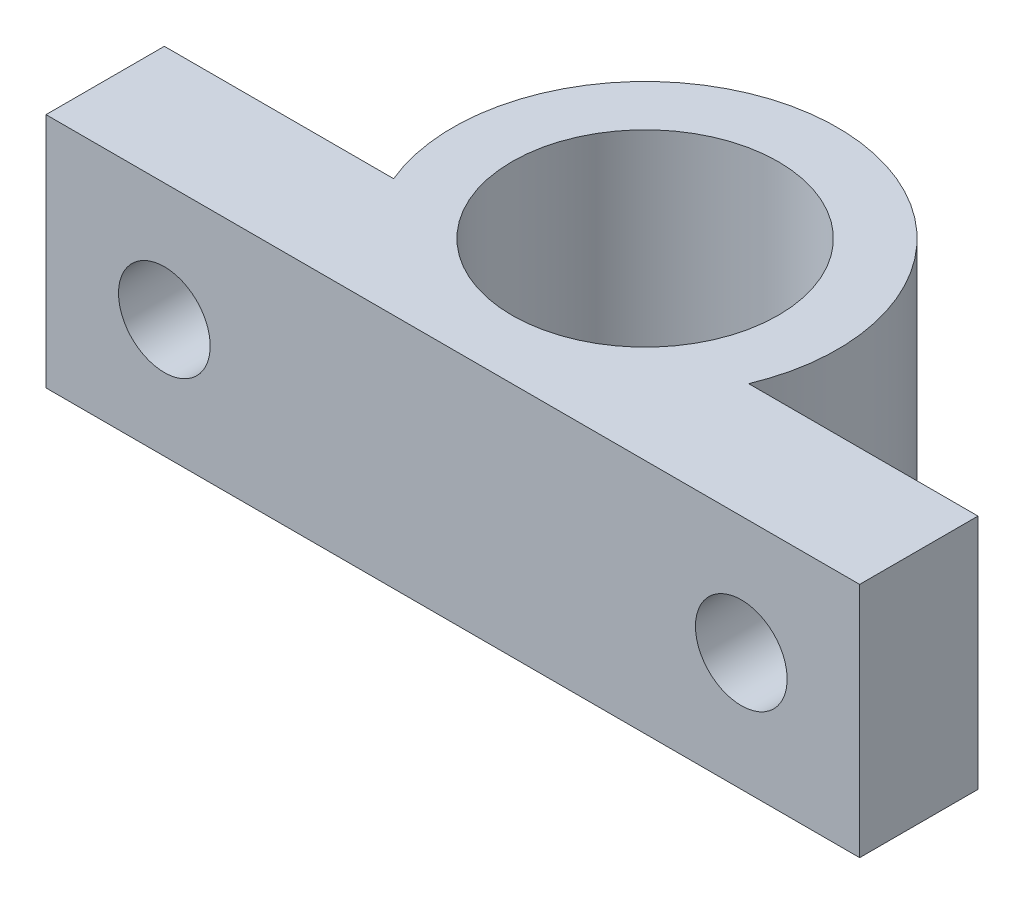
ISO-10303-21;
HEADER;
FILE_DESCRIPTION(('STEP AP214'),'2;1');
FILE_NAME('part.step','',(''),(''),'','','');
FILE_SCHEMA(('AUTOMOTIVE_DESIGN { 1 0 10303 214 1 1 1 1 }'));
ENDSEC;
DATA;
#1=APPLICATION_CONTEXT('core data for automotive mechanical design processes');
#2=APPLICATION_PROTOCOL_DEFINITION('international standard','automotive_design',2000,#1);
#3=PRODUCT_CONTEXT('',#1,'mechanical');
#4=PRODUCT('Part','Part','',(#3));
#5=PRODUCT_RELATED_PRODUCT_CATEGORY('part','',(#4));
#6=PRODUCT_DEFINITION_FORMATION('','',#4);
#7=PRODUCT_DEFINITION_CONTEXT('part definition',#1,'design');
#8=PRODUCT_DEFINITION('design','',#6,#7);
#9=PRODUCT_DEFINITION_SHAPE('','',#8);
#10=(LENGTH_UNIT() NAMED_UNIT(*) SI_UNIT(.MILLI.,.METRE.));
#11=(NAMED_UNIT(*) PLANE_ANGLE_UNIT() SI_UNIT($,.RADIAN.));
#12=(NAMED_UNIT(*) SI_UNIT($,.STERADIAN.) SOLID_ANGLE_UNIT());
#13=UNCERTAINTY_MEASURE_WITH_UNIT(LENGTH_MEASURE(1.E-05),#10,'distance_accuracy_value','');
#14=(GEOMETRIC_REPRESENTATION_CONTEXT(3) GLOBAL_UNCERTAINTY_ASSIGNED_CONTEXT((#13)) GLOBAL_UNIT_ASSIGNED_CONTEXT((#10,
#11,#12)) REPRESENTATION_CONTEXT('',''));
#15=CARTESIAN_POINT('',(0.,0.,0.));
#16=DIRECTION('',(0.,0.,1.));
#17=DIRECTION('',(1.,0.,0.));
#18=AXIS2_PLACEMENT_3D('',#15,#16,#17);
#19=CARTESIAN_POINT('',(0.,8.,0.));
#20=DIRECTION('',(0.,-1.,0.));
#21=DIRECTION('',(0.,0.,-1.));
#22=AXIS2_PLACEMENT_3D('',#19,#20,#21);
#23=CYLINDRICAL_SURFACE('',#22,6.5);
#24=CARTESIAN_POINT('',(0.,8.,0.));
#25=DIRECTION('',(0.,1.,0.));
#26=DIRECTION('',(0.,0.,1.));
#27=AXIS2_PLACEMENT_3D('',#24,#25,#26);
#28=CIRCLE('',#27,6.5);
#29=CARTESIAN_POINT('',(6.,8.,2.5));
#30=VERTEX_POINT('',#29);
#31=CARTESIAN_POINT('',(-6.,8.,2.5));
#32=VERTEX_POINT('',#31);
#33=EDGE_CURVE('E11',#30,#32,#28,.T.);
#34=ORIENTED_EDGE('',*,*,#33,.F.);
#35=DIRECTION('',(0.,-1.,0.));
#36=VECTOR('',#35,1.);
#37=CARTESIAN_POINT('',(6.,8.,2.5));
#38=LINE('',#37,#36);
#39=CARTESIAN_POINT('',(6.,0.,2.5));
#40=VERTEX_POINT('',#39);
#41=EDGE_CURVE('E139',#30,#40,#38,.T.);
#42=ORIENTED_EDGE('',*,*,#41,.T.);
#43=CARTESIAN_POINT('',(0.,0.,0.));
#44=DIRECTION('',(0.,1.,0.));
#45=DIRECTION('',(0.,0.,1.));
#46=AXIS2_PLACEMENT_3D('',#43,#44,#45);
#47=CIRCLE('',#46,6.5);
#48=CARTESIAN_POINT('',(-6.,0.,2.5));
#49=VERTEX_POINT('',#48);
#50=EDGE_CURVE('E44',#40,#49,#47,.T.);
#51=ORIENTED_EDGE('',*,*,#50,.T.);
#52=DIRECTION('',(0.,-1.,0.));
#53=VECTOR('',#52,1.);
#54=CARTESIAN_POINT('',(-6.,8.,2.5));
#55=LINE('',#54,#53);
#56=EDGE_CURVE('E110',#49,#32,#55,.F.);
#57=ORIENTED_EDGE('',*,*,#56,.T.);
#58=EDGE_LOOP('',(#34,#42,#51,#57));
#59=FACE_BOUND('',#58,.T.);
#60=ADVANCED_FACE('F41',(#59),#23,.T.);
#61=CARTESIAN_POINT('',(0.,8.,0.));
#62=DIRECTION('',(0.,1.,0.));
#63=DIRECTION('',(0.,0.,1.));
#64=AXIS2_PLACEMENT_3D('',#61,#62,#63);
#65=PLANE('',#64);
#66=CARTESIAN_POINT('',(0.,8.,0.));
#67=DIRECTION('',(0.,1.,0.));
#68=DIRECTION('',(0.,0.,1.));
#69=AXIS2_PLACEMENT_3D('',#66,#67,#68);
#70=CIRCLE('',#69,4.5);
#71=CARTESIAN_POINT('',(0.,8.,4.5));
#72=VERTEX_POINT('',#71);
#73=EDGE_CURVE('E209',#72,#72,#70,.T.);
#74=ORIENTED_EDGE('',*,*,#73,.F.);
#75=EDGE_LOOP('',(#74));
#76=FACE_BOUND('',#75,.T.);
#77=ORIENTED_EDGE('',*,*,#33,.T.);
#78=DIRECTION('',(-1.,0.,0.));
#79=VECTOR('',#78,1.);
#80=CARTESIAN_POINT('',(-13.75,8.,2.5));
#81=LINE('',#80,#79);
#82=CARTESIAN_POINT('',(-13.75,8.,2.5));
#83=VERTEX_POINT('',#82);
#84=EDGE_CURVE('E55',#32,#83,#81,.T.);
#85=ORIENTED_EDGE('',*,*,#84,.T.);
#86=DIRECTION('',(0.,0.,1.));
#87=VECTOR('',#86,1.);
#88=CARTESIAN_POINT('',(-13.75,8.,2.5));
#89=LINE('',#88,#87);
#90=CARTESIAN_POINT('',(-13.75,8.,6.5));
#91=VERTEX_POINT('',#90);
#92=EDGE_CURVE('E116',#83,#91,#89,.T.);
#93=ORIENTED_EDGE('',*,*,#92,.T.);
#94=DIRECTION('',(-1.,0.,0.));
#95=VECTOR('',#94,1.);
#96=CARTESIAN_POINT('',(-13.75,8.,6.5));
#97=LINE('',#96,#95);
#98=CARTESIAN_POINT('',(13.75,8.,6.5));
#99=VERTEX_POINT('',#98);
#100=EDGE_CURVE('E117',#99,#91,#97,.T.);
#101=ORIENTED_EDGE('',*,*,#100,.F.);
#102=DIRECTION('',(0.,0.,1.));
#103=VECTOR('',#102,1.);
#104=CARTESIAN_POINT('',(13.75,8.,2.5));
#105=LINE('',#104,#103);
#106=CARTESIAN_POINT('',(13.75,8.,2.5));
#107=VERTEX_POINT('',#106);
#108=EDGE_CURVE('E135',#107,#99,#105,.T.);
#109=ORIENTED_EDGE('',*,*,#108,.F.);
#110=EDGE_CURVE('E106',#107,#30,#81,.T.);
#111=ORIENTED_EDGE('',*,*,#110,.T.);
#112=EDGE_LOOP('',(#77,#85,#93,#101,#109,#111));
#113=FACE_BOUND('',#112,.T.);
#114=ADVANCED_FACE('F149',(#76,#113),#65,.T.);
#115=CARTESIAN_POINT('',(0.,0.,0.));
#116=DIRECTION('',(0.,1.,0.));
#117=DIRECTION('',(0.,0.,1.));
#118=AXIS2_PLACEMENT_3D('',#115,#116,#117);
#119=PLANE('',#118);
#120=CARTESIAN_POINT('',(0.,0.,0.));
#121=DIRECTION('',(0.,1.,0.));
#122=DIRECTION('',(0.,0.,1.));
#123=AXIS2_PLACEMENT_3D('',#120,#121,#122);
#124=CIRCLE('',#123,4.5);
#125=CARTESIAN_POINT('',(0.,0.,4.5));
#126=VERTEX_POINT('',#125);
#127=EDGE_CURVE('E122',#126,#126,#124,.F.);
#128=ORIENTED_EDGE('',*,*,#127,.F.);
#129=EDGE_LOOP('',(#128));
#130=FACE_BOUND('',#129,.T.);
#131=ORIENTED_EDGE('',*,*,#50,.F.);
#132=DIRECTION('',(1.,0.,0.));
#133=VECTOR('',#132,1.);
#134=CARTESIAN_POINT('',(13.75,0.,2.5));
#135=LINE('',#134,#133);
#136=CARTESIAN_POINT('',(13.75,0.,2.5));
#137=VERTEX_POINT('',#136);
#138=EDGE_CURVE('E63',#40,#137,#135,.T.);
#139=ORIENTED_EDGE('',*,*,#138,.T.);
#140=DIRECTION('',(0.,0.,1.));
#141=VECTOR('',#140,1.);
#142=CARTESIAN_POINT('',(13.75,0.,2.5));
#143=LINE('',#142,#141);
#144=CARTESIAN_POINT('',(13.75,0.,6.5));
#145=VERTEX_POINT('',#144);
#146=EDGE_CURVE('E105',#137,#145,#143,.T.);
#147=ORIENTED_EDGE('',*,*,#146,.T.);
#148=DIRECTION('',(1.,0.,0.));
#149=VECTOR('',#148,1.);
#150=CARTESIAN_POINT('',(13.75,0.,6.5));
#151=LINE('',#150,#149);
#152=CARTESIAN_POINT('',(-13.75,0.,6.5));
#153=VERTEX_POINT('',#152);
#154=EDGE_CURVE('E100',#153,#145,#151,.T.);
#155=ORIENTED_EDGE('',*,*,#154,.F.);
#156=DIRECTION('',(0.,0.,1.));
#157=VECTOR('',#156,1.);
#158=CARTESIAN_POINT('',(-13.75,0.,2.5));
#159=LINE('',#158,#157);
#160=CARTESIAN_POINT('',(-13.75,0.,2.5));
#161=VERTEX_POINT('',#160);
#162=EDGE_CURVE('E93',#161,#153,#159,.T.);
#163=ORIENTED_EDGE('',*,*,#162,.F.);
#164=EDGE_CURVE('E97',#161,#49,#135,.T.);
#165=ORIENTED_EDGE('',*,*,#164,.T.);
#166=EDGE_LOOP('',(#131,#139,#147,#155,#163,#165));
#167=FACE_BOUND('',#166,.T.);
#168=ADVANCED_FACE('F96',(#130,#167),#119,.F.);
#169=CARTESIAN_POINT('',(0.,0.,2.5));
#170=DIRECTION('',(0.,0.,-1.));
#171=DIRECTION('',(-1.,0.,0.));
#172=AXIS2_PLACEMENT_3D('',#169,#170,#171);
#173=PLANE('',#172);
#174=CARTESIAN_POINT('',(9.75,4.,2.5));
#175=DIRECTION('',(0.,0.,-1.));
#176=DIRECTION('',(-1.,0.,0.));
#177=AXIS2_PLACEMENT_3D('',#174,#175,#176);
#178=CIRCLE('',#177,1.55);
#179=CARTESIAN_POINT('',(8.2,4.,2.5));
#180=VERTEX_POINT('',#179);
#181=EDGE_CURVE('E200',#180,#180,#178,.T.);
#182=ORIENTED_EDGE('',*,*,#181,.F.);
#183=EDGE_LOOP('',(#182));
#184=FACE_BOUND('',#183,.T.);
#185=ORIENTED_EDGE('',*,*,#41,.F.);
#186=ORIENTED_EDGE('',*,*,#110,.F.);
#187=DIRECTION('',(0.,1.,0.));
#188=VECTOR('',#187,1.);
#189=CARTESIAN_POINT('',(13.75,8.,2.5));
#190=LINE('',#189,#188);
#191=EDGE_CURVE('E111',#137,#107,#190,.T.);
#192=ORIENTED_EDGE('',*,*,#191,.F.);
#193=ORIENTED_EDGE('',*,*,#138,.F.);
#194=EDGE_LOOP('',(#185,#186,#192,#193));
#195=FACE_BOUND('',#194,.T.);
#196=ADVANCED_FACE('F147',(#184,#195),#173,.T.);
#197=CARTESIAN_POINT('',(-9.75,4.,2.5));
#198=DIRECTION('',(0.,0.,-1.));
#199=DIRECTION('',(-1.,0.,0.));
#200=AXIS2_PLACEMENT_3D('',#197,#198,#199);
#201=CIRCLE('',#200,1.55);
#202=CARTESIAN_POINT('',(-11.3,4.,2.5));
#203=VERTEX_POINT('',#202);
#204=EDGE_CURVE('E204',#203,#203,#201,.T.);
#205=ORIENTED_EDGE('',*,*,#204,.F.);
#206=EDGE_LOOP('',(#205));
#207=FACE_BOUND('',#206,.T.);
#208=ORIENTED_EDGE('',*,*,#56,.F.);
#209=ORIENTED_EDGE('',*,*,#164,.F.);
#210=DIRECTION('',(0.,-1.,0.));
#211=VECTOR('',#210,1.);
#212=CARTESIAN_POINT('',(-13.75,0.,2.5));
#213=LINE('',#212,#211);
#214=EDGE_CURVE('E109',#83,#161,#213,.T.);
#215=ORIENTED_EDGE('',*,*,#214,.F.);
#216=ORIENTED_EDGE('',*,*,#84,.F.);
#217=EDGE_LOOP('',(#208,#209,#215,#216));
#218=FACE_BOUND('',#217,.T.);
#219=ADVANCED_FACE('F108',(#207,#218),#173,.T.);
#220=CARTESIAN_POINT('',(0.,0.,6.5));
#221=DIRECTION('',(0.,0.,-1.));
#222=DIRECTION('',(-1.,0.,0.));
#223=AXIS2_PLACEMENT_3D('',#220,#221,#222);
#224=PLANE('',#223);
#225=CARTESIAN_POINT('',(-9.75,4.,6.5));
#226=DIRECTION('',(0.,0.,-1.));
#227=DIRECTION('',(-1.,0.,0.));
#228=AXIS2_PLACEMENT_3D('',#225,#226,#227);
#229=CIRCLE('',#228,1.55);
#230=CARTESIAN_POINT('',(-11.3,4.,6.5));
#231=VERTEX_POINT('',#230);
#232=EDGE_CURVE('E207',#231,#231,#229,.F.);
#233=ORIENTED_EDGE('',*,*,#232,.F.);
#234=EDGE_LOOP('',(#233));
#235=FACE_BOUND('',#234,.T.);
#236=CARTESIAN_POINT('',(9.75,4.,6.5));
#237=DIRECTION('',(0.,0.,-1.));
#238=DIRECTION('',(-1.,0.,0.));
#239=AXIS2_PLACEMENT_3D('',#236,#237,#238);
#240=CIRCLE('',#239,1.55);
#241=CARTESIAN_POINT('',(8.2,4.,6.5));
#242=VERTEX_POINT('',#241);
#243=EDGE_CURVE('E201',#242,#242,#240,.F.);
#244=ORIENTED_EDGE('',*,*,#243,.F.);
#245=EDGE_LOOP('',(#244));
#246=FACE_BOUND('',#245,.T.);
#247=ORIENTED_EDGE('',*,*,#100,.T.);
#248=DIRECTION('',(0.,-1.,0.));
#249=VECTOR('',#248,1.);
#250=CARTESIAN_POINT('',(-13.75,0.,6.5));
#251=LINE('',#250,#249);
#252=EDGE_CURVE('E129',#91,#153,#251,.T.);
#253=ORIENTED_EDGE('',*,*,#252,.T.);
#254=ORIENTED_EDGE('',*,*,#154,.T.);
#255=DIRECTION('',(0.,1.,0.));
#256=VECTOR('',#255,1.);
#257=CARTESIAN_POINT('',(13.75,8.,6.5));
#258=LINE('',#257,#256);
#259=EDGE_CURVE('E119',#145,#99,#258,.T.);
#260=ORIENTED_EDGE('',*,*,#259,.T.);
#261=EDGE_LOOP('',(#247,#253,#254,#260));
#262=FACE_BOUND('',#261,.T.);
#263=ADVANCED_FACE('F152',(#235,#246,#262),#224,.F.);
#264=CARTESIAN_POINT('',(-13.75,0.,2.5));
#265=DIRECTION('',(-1.,0.,0.));
#266=DIRECTION('',(0.,0.,1.));
#267=AXIS2_PLACEMENT_3D('',#264,#265,#266);
#268=PLANE('',#267);
#269=ORIENTED_EDGE('',*,*,#252,.F.);
#270=ORIENTED_EDGE('',*,*,#92,.F.);
#271=ORIENTED_EDGE('',*,*,#214,.T.);
#272=ORIENTED_EDGE('',*,*,#162,.T.);
#273=EDGE_LOOP('',(#269,#270,#271,#272));
#274=FACE_BOUND('',#273,.T.);
#275=ADVANCED_FACE('F114',(#274),#268,.T.);
#276=CARTESIAN_POINT('',(13.75,8.,2.5));
#277=DIRECTION('',(1.,0.,0.));
#278=DIRECTION('',(0.,1.,0.));
#279=AXIS2_PLACEMENT_3D('',#276,#277,#278);
#280=PLANE('',#279);
#281=ORIENTED_EDGE('',*,*,#259,.F.);
#282=ORIENTED_EDGE('',*,*,#146,.F.);
#283=ORIENTED_EDGE('',*,*,#191,.T.);
#284=ORIENTED_EDGE('',*,*,#108,.T.);
#285=EDGE_LOOP('',(#281,#282,#283,#284));
#286=FACE_BOUND('',#285,.T.);
#287=ADVANCED_FACE('F145',(#286),#280,.T.);
#288=CARTESIAN_POINT('',(0.,-0.00100000000000273,0.));
#289=DIRECTION('',(0.,1.,0.));
#290=DIRECTION('',(0.,0.,1.));
#291=AXIS2_PLACEMENT_3D('',#288,#289,#290);
#292=CYLINDRICAL_SURFACE('',#291,4.5);
#293=ORIENTED_EDGE('',*,*,#73,.T.);
#294=EDGE_LOOP('',(#293));
#295=FACE_BOUND('',#294,.T.);
#296=ORIENTED_EDGE('',*,*,#127,.T.);
#297=EDGE_LOOP('',(#296));
#298=FACE_BOUND('',#297,.T.);
#299=ADVANCED_FACE('F178',(#295,#298),#292,.F.);
#300=CARTESIAN_POINT('',(9.75,4.,6.501));
#301=DIRECTION('',(0.,0.,-1.));
#302=DIRECTION('',(-1.,0.,0.));
#303=AXIS2_PLACEMENT_3D('',#300,#301,#302);
#304=CYLINDRICAL_SURFACE('',#303,1.55);
#305=ORIENTED_EDGE('',*,*,#181,.T.);
#306=EDGE_LOOP('',(#305));
#307=FACE_BOUND('',#306,.T.);
#308=ORIENTED_EDGE('',*,*,#243,.T.);
#309=EDGE_LOOP('',(#308));
#310=FACE_BOUND('',#309,.T.);
#311=ADVANCED_FACE('F182',(#307,#310),#304,.F.);
#312=CARTESIAN_POINT('',(-9.75,4.,6.501));
#313=DIRECTION('',(0.,0.,-1.));
#314=DIRECTION('',(-1.,0.,0.));
#315=AXIS2_PLACEMENT_3D('',#312,#313,#314);
#316=CYLINDRICAL_SURFACE('',#315,1.55);
#317=ORIENTED_EDGE('',*,*,#204,.T.);
#318=EDGE_LOOP('',(#317));
#319=FACE_BOUND('',#318,.T.);
#320=ORIENTED_EDGE('',*,*,#232,.T.);
#321=EDGE_LOOP('',(#320));
#322=FACE_BOUND('',#321,.T.);
#323=ADVANCED_FACE('F188',(#319,#322),#316,.F.);
#324=CLOSED_SHELL('',(#60,#114,#168,#196,#219,#263,#275,#287,#299,#311,#323));
#325=MANIFOLD_SOLID_BREP('B2',#324);
#326=ADVANCED_BREP_SHAPE_REPRESENTATION('',(#18,#325),#14);
#327=SHAPE_DEFINITION_REPRESENTATION(#9,#326);
ENDSEC;
END-ISO-10303-21;
